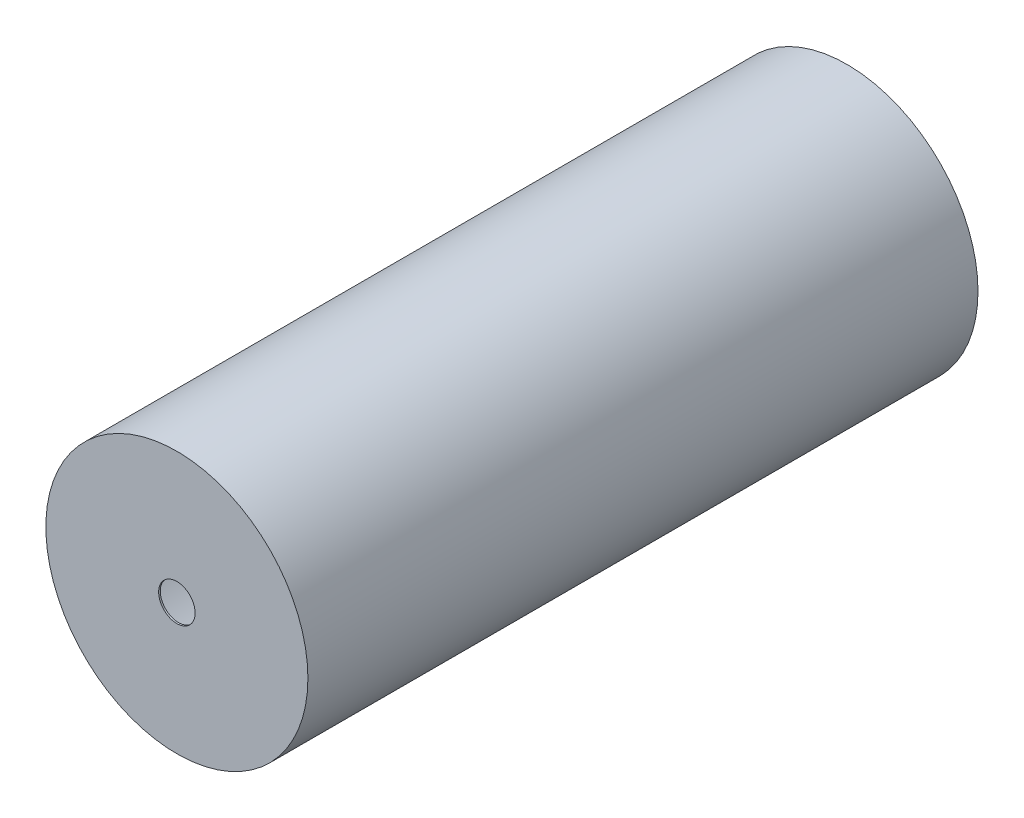
ISO-10303-21;
HEADER;
FILE_DESCRIPTION(('STEP AP214'),'2;1');
FILE_NAME('part.step','',(''),(''),'','','');
FILE_SCHEMA(('AUTOMOTIVE_DESIGN { 1 0 10303 214 1 1 1 1 }'));
ENDSEC;
DATA;
#1=APPLICATION_CONTEXT('core data for automotive mechanical design processes');
#2=APPLICATION_PROTOCOL_DEFINITION('international standard','automotive_design',2000,#1);
#3=PRODUCT_CONTEXT('',#1,'mechanical');
#4=PRODUCT('Part','Part','',(#3));
#5=PRODUCT_RELATED_PRODUCT_CATEGORY('part','',(#4));
#6=PRODUCT_DEFINITION_FORMATION('','',#4);
#7=PRODUCT_DEFINITION_CONTEXT('part definition',#1,'design');
#8=PRODUCT_DEFINITION('design','',#6,#7);
#9=PRODUCT_DEFINITION_SHAPE('','',#8);
#10=(LENGTH_UNIT() NAMED_UNIT(*) SI_UNIT(.MILLI.,.METRE.));
#11=(NAMED_UNIT(*) PLANE_ANGLE_UNIT() SI_UNIT($,.RADIAN.));
#12=(NAMED_UNIT(*) SI_UNIT($,.STERADIAN.) SOLID_ANGLE_UNIT());
#13=UNCERTAINTY_MEASURE_WITH_UNIT(LENGTH_MEASURE(1.E-05),#10,'distance_accuracy_value','');
#14=(GEOMETRIC_REPRESENTATION_CONTEXT(3) GLOBAL_UNCERTAINTY_ASSIGNED_CONTEXT((#13)) GLOBAL_UNIT_ASSIGNED_CONTEXT((#10,
#11,#12)) REPRESENTATION_CONTEXT('',''));
#15=CARTESIAN_POINT('',(0.,0.,0.));
#16=DIRECTION('',(0.,0.,1.));
#17=DIRECTION('',(1.,0.,0.));
#18=AXIS2_PLACEMENT_3D('',#15,#16,#17);
#19=CARTESIAN_POINT('',(0.,0.,40.3));
#20=DIRECTION('',(0.,0.,-1.));
#21=DIRECTION('',(-1.,0.,0.));
#22=AXIS2_PLACEMENT_3D('',#19,#20,#21);
#23=CYLINDRICAL_SURFACE('',#22,7.8);
#24=CARTESIAN_POINT('',(0.,0.,40.3));
#25=DIRECTION('',(0.,0.,1.));
#26=DIRECTION('',(1.,0.,0.));
#27=AXIS2_PLACEMENT_3D('',#24,#25,#26);
#28=CIRCLE('',#27,7.8);
#29=CARTESIAN_POINT('',(7.8,0.,40.3));
#30=VERTEX_POINT('',#29);
#31=EDGE_CURVE('E48',#30,#30,#28,.T.);
#32=ORIENTED_EDGE('',*,*,#31,.T.);
#33=EDGE_LOOP('',(#32));
#34=FACE_BOUND('',#33,.T.);
#35=CARTESIAN_POINT('',(0.,0.,0.1));
#36=DIRECTION('',(0.,0.,1.));
#37=DIRECTION('',(1.,0.,0.));
#38=AXIS2_PLACEMENT_3D('',#35,#36,#37);
#39=CIRCLE('',#38,7.8);
#40=CARTESIAN_POINT('',(7.8,0.,0.1));
#41=VERTEX_POINT('',#40);
#42=EDGE_CURVE('E50',#41,#41,#39,.T.);
#43=ORIENTED_EDGE('',*,*,#42,.F.);
#44=EDGE_LOOP('',(#43));
#45=FACE_BOUND('',#44,.T.);
#46=ADVANCED_FACE('F35',(#34,#45),#23,.F.);
#47=CARTESIAN_POINT('',(0.,0.,40.3));
#48=DIRECTION('',(0.,0.,1.));
#49=DIRECTION('',(1.,0.,0.));
#50=AXIS2_PLACEMENT_3D('',#47,#48,#49);
#51=PLANE('',#50);
#52=CARTESIAN_POINT('',(0.,0.,40.3));
#53=DIRECTION('',(0.,0.,1.));
#54=DIRECTION('',(1.,0.,0.));
#55=AXIS2_PLACEMENT_3D('',#52,#53,#54);
#56=CIRCLE('',#55,1.1);
#57=CARTESIAN_POINT('',(1.1,0.,40.3));
#58=VERTEX_POINT('',#57);
#59=EDGE_CURVE('E58',#58,#58,#56,.T.);
#60=ORIENTED_EDGE('',*,*,#59,.T.);
#61=EDGE_LOOP('',(#60));
#62=FACE_BOUND('',#61,.T.);
#63=ORIENTED_EDGE('',*,*,#31,.F.);
#64=EDGE_LOOP('',(#63));
#65=FACE_BOUND('',#64,.T.);
#66=ADVANCED_FACE('F73',(#62,#65),#51,.F.);
#67=CARTESIAN_POINT('',(0.,0.,0.1));
#68=DIRECTION('',(0.,0.,1.));
#69=DIRECTION('',(1.,0.,0.));
#70=AXIS2_PLACEMENT_3D('',#67,#68,#69);
#71=PLANE('',#70);
#72=CARTESIAN_POINT('',(0.,0.,0.100000000000003));
#73=DIRECTION('',(0.,0.,1.));
#74=DIRECTION('',(1.,0.,0.));
#75=AXIS2_PLACEMENT_3D('',#72,#73,#74);
#76=CIRCLE('',#75,1.1);
#77=CARTESIAN_POINT('',(1.1,0.,0.100000000000003));
#78=VERTEX_POINT('',#77);
#79=EDGE_CURVE('E39',#78,#78,#76,.T.);
#80=ORIENTED_EDGE('',*,*,#79,.F.);
#81=EDGE_LOOP('',(#80));
#82=FACE_BOUND('',#81,.T.);
#83=ORIENTED_EDGE('',*,*,#42,.T.);
#84=EDGE_LOOP('',(#83));
#85=FACE_BOUND('',#84,.T.);
#86=ADVANCED_FACE('F70',(#82,#85),#71,.T.);
#87=CARTESIAN_POINT('',(0.,0.,53.));
#88=DIRECTION('',(0.,0.,-1.));
#89=DIRECTION('',(-1.,0.,0.));
#90=AXIS2_PLACEMENT_3D('',#87,#88,#89);
#91=CYLINDRICAL_SURFACE('',#90,1.1);
#92=ORIENTED_EDGE('',*,*,#79,.T.);
#93=EDGE_LOOP('',(#92));
#94=FACE_BOUND('',#93,.T.);
#95=CARTESIAN_POINT('',(0.,0.,0.));
#96=DIRECTION('',(0.,0.,-1.));
#97=DIRECTION('',(-1.,0.,0.));
#98=AXIS2_PLACEMENT_3D('',#95,#96,#97);
#99=CIRCLE('',#98,1.1);
#100=CARTESIAN_POINT('',(-1.1,0.,0.));
#101=VERTEX_POINT('',#100);
#102=EDGE_CURVE('E61',#101,#101,#99,.T.);
#103=ORIENTED_EDGE('',*,*,#102,.T.);
#104=EDGE_LOOP('',(#103));
#105=FACE_BOUND('',#104,.T.);
#106=ADVANCED_FACE('F68',(#94,#105),#91,.F.);
#107=CARTESIAN_POINT('',(0.,0.,40.4));
#108=DIRECTION('',(0.,0.,1.));
#109=DIRECTION('',(1.,0.,0.));
#110=AXIS2_PLACEMENT_3D('',#107,#108,#109);
#111=CIRCLE('',#110,1.1);
#112=CARTESIAN_POINT('',(1.1,0.,40.4));
#113=VERTEX_POINT('',#112);
#114=EDGE_CURVE('E53',#113,#113,#111,.T.);
#115=ORIENTED_EDGE('',*,*,#114,.T.);
#116=EDGE_LOOP('',(#115));
#117=FACE_BOUND('',#116,.T.);
#118=ORIENTED_EDGE('',*,*,#59,.F.);
#119=EDGE_LOOP('',(#118));
#120=FACE_BOUND('',#119,.T.);
#121=ADVANCED_FACE('F98',(#117,#120),#91,.F.);
#122=CARTESIAN_POINT('',(0.,0.,40.4));
#123=DIRECTION('',(0.,0.,-1.));
#124=DIRECTION('',(-1.,0.,0.));
#125=AXIS2_PLACEMENT_3D('',#122,#123,#124);
#126=CYLINDRICAL_SURFACE('',#125,7.9);
#127=CARTESIAN_POINT('',(0.,0.,40.4));
#128=DIRECTION('',(0.,0.,1.));
#129=DIRECTION('',(1.,0.,0.));
#130=AXIS2_PLACEMENT_3D('',#127,#128,#129);
#131=CIRCLE('',#130,7.9);
#132=CARTESIAN_POINT('',(7.9,0.,40.4));
#133=VERTEX_POINT('',#132);
#134=EDGE_CURVE('E10',#133,#133,#131,.T.);
#135=ORIENTED_EDGE('',*,*,#134,.F.);
#136=EDGE_LOOP('',(#135));
#137=FACE_BOUND('',#136,.T.);
#138=CARTESIAN_POINT('',(0.,0.,0.));
#139=DIRECTION('',(0.,0.,1.));
#140=DIRECTION('',(1.,0.,0.));
#141=AXIS2_PLACEMENT_3D('',#138,#139,#140);
#142=CIRCLE('',#141,7.9);
#143=CARTESIAN_POINT('',(7.9,0.,0.));
#144=VERTEX_POINT('',#143);
#145=EDGE_CURVE('E43',#144,#144,#142,.T.);
#146=ORIENTED_EDGE('',*,*,#145,.T.);
#147=EDGE_LOOP('',(#146));
#148=FACE_BOUND('',#147,.T.);
#149=ADVANCED_FACE('F37',(#137,#148),#126,.T.);
#150=CARTESIAN_POINT('',(0.,0.,40.4));
#151=DIRECTION('',(0.,0.,1.));
#152=DIRECTION('',(1.,0.,0.));
#153=AXIS2_PLACEMENT_3D('',#150,#151,#152);
#154=PLANE('',#153);
#155=ORIENTED_EDGE('',*,*,#114,.F.);
#156=EDGE_LOOP('',(#155));
#157=FACE_BOUND('',#156,.T.);
#158=ORIENTED_EDGE('',*,*,#134,.T.);
#159=EDGE_LOOP('',(#158));
#160=FACE_BOUND('',#159,.T.);
#161=ADVANCED_FACE('F86',(#157,#160),#154,.T.);
#162=CARTESIAN_POINT('',(0.,0.,0.));
#163=DIRECTION('',(0.,0.,1.));
#164=DIRECTION('',(1.,0.,0.));
#165=AXIS2_PLACEMENT_3D('',#162,#163,#164);
#166=PLANE('',#165);
#167=ORIENTED_EDGE('',*,*,#102,.F.);
#168=EDGE_LOOP('',(#167));
#169=FACE_BOUND('',#168,.T.);
#170=ORIENTED_EDGE('',*,*,#145,.F.);
#171=EDGE_LOOP('',(#170));
#172=FACE_BOUND('',#171,.T.);
#173=ADVANCED_FACE('F88',(#169,#172),#166,.F.);
#174=CLOSED_SHELL('',(#46,#66,#86,#106,#121,#149,#161,#173));
#175=MANIFOLD_SOLID_BREP('B2',#174);
#176=ADVANCED_BREP_SHAPE_REPRESENTATION('',(#18,#175),#14);
#177=SHAPE_DEFINITION_REPRESENTATION(#9,#176);
ENDSEC;
END-ISO-10303-21;
